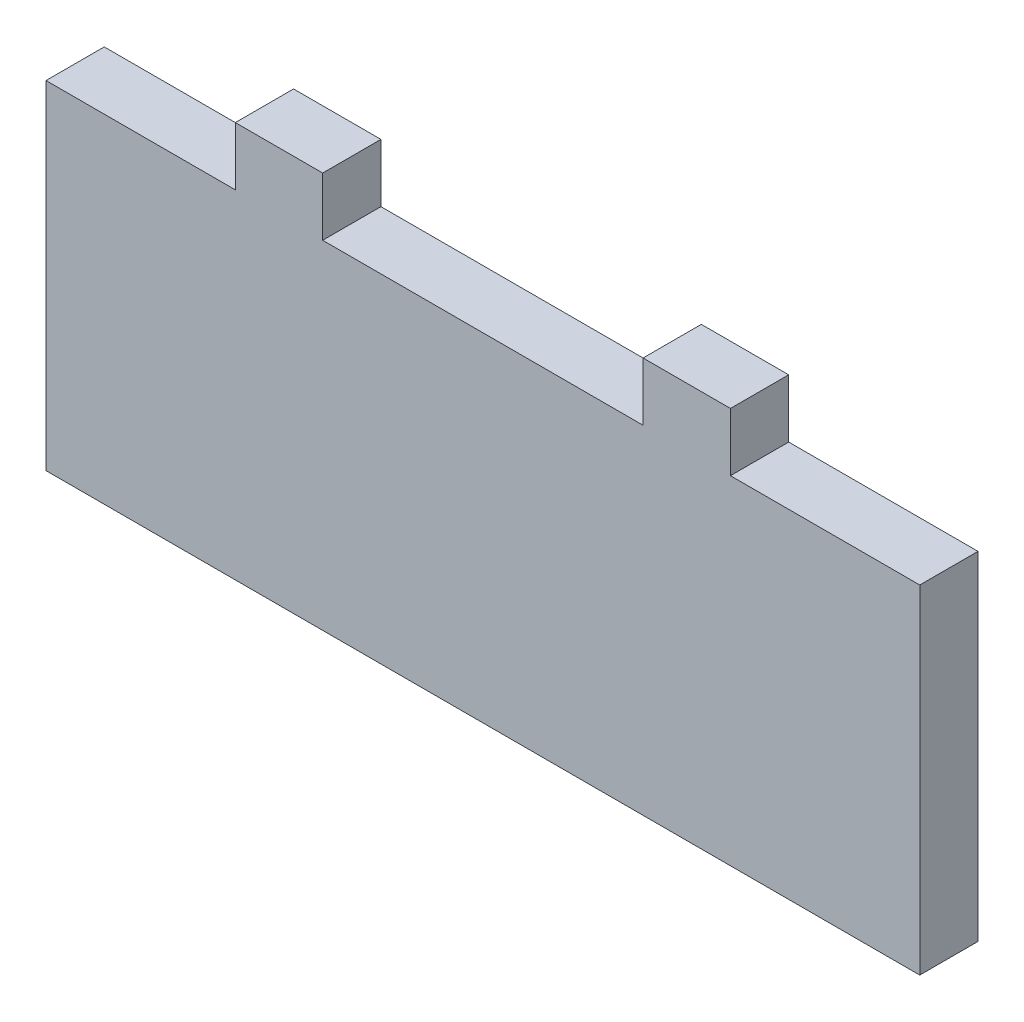
ISO-10303-21;
HEADER;
FILE_DESCRIPTION(('STEP AP214'),'2;1');
FILE_NAME('part.step','',(''),(''),'','','');
FILE_SCHEMA(('AUTOMOTIVE_DESIGN { 1 0 10303 214 1 1 1 1 }'));
ENDSEC;
DATA;
#1=APPLICATION_CONTEXT('core data for automotive mechanical design processes');
#2=APPLICATION_PROTOCOL_DEFINITION('international standard','automotive_design',2000,#1);
#3=PRODUCT_CONTEXT('',#1,'mechanical');
#4=PRODUCT('Part','Part','',(#3));
#5=PRODUCT_RELATED_PRODUCT_CATEGORY('part','',(#4));
#6=PRODUCT_DEFINITION_FORMATION('','',#4);
#7=PRODUCT_DEFINITION_CONTEXT('part definition',#1,'design');
#8=PRODUCT_DEFINITION('design','',#6,#7);
#9=PRODUCT_DEFINITION_SHAPE('','',#8);
#10=(LENGTH_UNIT() NAMED_UNIT(*) SI_UNIT(.MILLI.,.METRE.));
#11=(NAMED_UNIT(*) PLANE_ANGLE_UNIT() SI_UNIT($,.RADIAN.));
#12=(NAMED_UNIT(*) SI_UNIT($,.STERADIAN.) SOLID_ANGLE_UNIT());
#13=UNCERTAINTY_MEASURE_WITH_UNIT(LENGTH_MEASURE(1.E-05),#10,'distance_accuracy_value','');
#14=(GEOMETRIC_REPRESENTATION_CONTEXT(3) GLOBAL_UNCERTAINTY_ASSIGNED_CONTEXT((#13)) GLOBAL_UNIT_ASSIGNED_CONTEXT((#10,
#11,#12)) REPRESENTATION_CONTEXT('',''));
#15=CARTESIAN_POINT('',(0.,0.,0.));
#16=DIRECTION('',(0.,0.,1.));
#17=DIRECTION('',(1.,0.,0.));
#18=AXIS2_PLACEMENT_3D('',#15,#16,#17);
#19=CARTESIAN_POINT('',(-95.2500000000001,215.9,-12.7));
#20=DIRECTION('',(-1.,0.,0.));
#21=DIRECTION('',(0.,-1.,0.));
#22=AXIS2_PLACEMENT_3D('',#19,#20,#21);
#23=PLANE('',#22);
#24=DIRECTION('',(0.,-1.,0.));
#25=VECTOR('',#24,1.);
#26=CARTESIAN_POINT('',(-95.2500000000001,215.9,0.));
#27=LINE('',#26,#25);
#28=CARTESIAN_POINT('',(-95.2500000000001,215.9,0.));
#29=VERTEX_POINT('',#28);
#30=CARTESIAN_POINT('',(-95.2500000000001,142.24,0.));
#31=VERTEX_POINT('',#30);
#32=EDGE_CURVE('E154',#29,#31,#27,.T.);
#33=ORIENTED_EDGE('',*,*,#32,.F.);
#34=DIRECTION('',(0.,0.,1.));
#35=VECTOR('',#34,1.);
#36=CARTESIAN_POINT('',(-95.2500000000001,215.9,-12.7));
#37=LINE('',#36,#35);
#38=CARTESIAN_POINT('',(-95.2500000000001,215.9,-12.7));
#39=VERTEX_POINT('',#38);
#40=EDGE_CURVE('E11',#39,#29,#37,.T.);
#41=ORIENTED_EDGE('',*,*,#40,.F.);
#42=DIRECTION('',(0.,-1.,0.));
#43=VECTOR('',#42,1.);
#44=CARTESIAN_POINT('',(-95.2500000000001,215.9,-12.7));
#45=LINE('',#44,#43);
#46=CARTESIAN_POINT('',(-95.2500000000001,142.24,-12.7));
#47=VERTEX_POINT('',#46);
#48=EDGE_CURVE('E186',#39,#47,#45,.T.);
#49=ORIENTED_EDGE('',*,*,#48,.T.);
#50=DIRECTION('',(0.,0.,1.));
#51=VECTOR('',#50,1.);
#52=CARTESIAN_POINT('',(-95.2500000000001,142.24,-12.7));
#53=LINE('',#52,#51);
#54=EDGE_CURVE('E36',#47,#31,#53,.T.);
#55=ORIENTED_EDGE('',*,*,#54,.T.);
#56=EDGE_LOOP('',(#33,#41,#49,#55));
#57=FACE_BOUND('',#56,.T.);
#58=ADVANCED_FACE('F33',(#57),#23,.T.);
#59=CARTESIAN_POINT('',(-95.2500000000001,215.9,-12.7));
#60=DIRECTION('',(0.,1.,0.));
#61=DIRECTION('',(0.,0.,1.));
#62=AXIS2_PLACEMENT_3D('',#59,#60,#61);
#63=PLANE('',#62);
#64=DIRECTION('',(-1.,0.,0.));
#65=VECTOR('',#64,1.);
#66=CARTESIAN_POINT('',(-95.2500000000001,215.9,0.));
#67=LINE('',#66,#65);
#68=CARTESIAN_POINT('',(-53.9750000000001,215.9,0.));
#69=VERTEX_POINT('',#68);
#70=EDGE_CURVE('E184',#69,#29,#67,.T.);
#71=ORIENTED_EDGE('',*,*,#70,.F.);
#72=DIRECTION('',(0.,0.,1.));
#73=VECTOR('',#72,1.);
#74=CARTESIAN_POINT('',(-53.9750000000001,215.9,-12.7));
#75=LINE('',#74,#73);
#76=CARTESIAN_POINT('',(-53.9750000000001,215.9,-12.7));
#77=VERTEX_POINT('',#76);
#78=EDGE_CURVE('E42',#77,#69,#75,.T.);
#79=ORIENTED_EDGE('',*,*,#78,.F.);
#80=DIRECTION('',(-1.,0.,0.));
#81=VECTOR('',#80,1.);
#82=CARTESIAN_POINT('',(-95.2500000000001,215.9,-12.7));
#83=LINE('',#82,#81);
#84=EDGE_CURVE('E144',#77,#39,#83,.T.);
#85=ORIENTED_EDGE('',*,*,#84,.T.);
#86=ORIENTED_EDGE('',*,*,#40,.T.);
#87=EDGE_LOOP('',(#71,#79,#85,#86));
#88=FACE_BOUND('',#87,.T.);
#89=ADVANCED_FACE('F206',(#88),#63,.T.);
#90=CARTESIAN_POINT('',(-53.9750000000001,215.9,-12.7));
#91=DIRECTION('',(-1.,0.,0.));
#92=DIRECTION('',(0.,-1.,0.));
#93=AXIS2_PLACEMENT_3D('',#90,#91,#92);
#94=PLANE('',#93);
#95=DIRECTION('',(0.,-1.,0.));
#96=VECTOR('',#95,1.);
#97=CARTESIAN_POINT('',(-53.9750000000001,215.9,0.));
#98=LINE('',#97,#96);
#99=CARTESIAN_POINT('',(-53.9750000000001,228.6,0.));
#100=VERTEX_POINT('',#99);
#101=EDGE_CURVE('E131',#100,#69,#98,.T.);
#102=ORIENTED_EDGE('',*,*,#101,.F.);
#103=DIRECTION('',(0.,0.,1.));
#104=VECTOR('',#103,1.);
#105=CARTESIAN_POINT('',(-53.9750000000001,228.6,-12.7));
#106=LINE('',#105,#104);
#107=CARTESIAN_POINT('',(-53.9750000000001,228.6,-12.7));
#108=VERTEX_POINT('',#107);
#109=EDGE_CURVE('E126',#108,#100,#106,.T.);
#110=ORIENTED_EDGE('',*,*,#109,.F.);
#111=DIRECTION('',(0.,-1.,0.));
#112=VECTOR('',#111,1.);
#113=CARTESIAN_POINT('',(-53.9750000000001,215.9,-12.7));
#114=LINE('',#113,#112);
#115=EDGE_CURVE('E129',#108,#77,#114,.T.);
#116=ORIENTED_EDGE('',*,*,#115,.T.);
#117=ORIENTED_EDGE('',*,*,#78,.T.);
#118=EDGE_LOOP('',(#102,#110,#116,#117));
#119=FACE_BOUND('',#118,.T.);
#120=ADVANCED_FACE('F128',(#119),#94,.T.);
#121=CARTESIAN_POINT('',(-34.9250000000001,228.6,-12.7));
#122=DIRECTION('',(0.,1.,0.));
#123=DIRECTION('',(0.,0.,1.));
#124=AXIS2_PLACEMENT_3D('',#121,#122,#123);
#125=PLANE('',#124);
#126=DIRECTION('',(-1.,0.,0.));
#127=VECTOR('',#126,1.);
#128=CARTESIAN_POINT('',(-34.9250000000001,228.6,0.));
#129=LINE('',#128,#127);
#130=CARTESIAN_POINT('',(-34.9250000000001,228.6,0.));
#131=VERTEX_POINT('',#130);
#132=EDGE_CURVE('E181',#131,#100,#129,.T.);
#133=ORIENTED_EDGE('',*,*,#132,.F.);
#134=DIRECTION('',(0.,0.,1.));
#135=VECTOR('',#134,1.);
#136=CARTESIAN_POINT('',(-34.9250000000001,228.6,-12.7));
#137=LINE('',#136,#135);
#138=CARTESIAN_POINT('',(-34.9250000000001,228.6,-12.7));
#139=VERTEX_POINT('',#138);
#140=EDGE_CURVE('E136',#139,#131,#137,.T.);
#141=ORIENTED_EDGE('',*,*,#140,.F.);
#142=DIRECTION('',(-1.,0.,0.));
#143=VECTOR('',#142,1.);
#144=CARTESIAN_POINT('',(-34.9250000000001,228.6,-12.7));
#145=LINE('',#144,#143);
#146=EDGE_CURVE('E142',#139,#108,#145,.T.);
#147=ORIENTED_EDGE('',*,*,#146,.T.);
#148=ORIENTED_EDGE('',*,*,#109,.T.);
#149=EDGE_LOOP('',(#133,#141,#147,#148));
#150=FACE_BOUND('',#149,.T.);
#151=ADVANCED_FACE('F146',(#150),#125,.T.);
#152=CARTESIAN_POINT('',(-34.9250000000001,215.9,-12.7));
#153=DIRECTION('',(1.,0.,0.));
#154=DIRECTION('',(0.,0.,-1.));
#155=AXIS2_PLACEMENT_3D('',#152,#153,#154);
#156=PLANE('',#155);
#157=DIRECTION('',(0.,1.,0.));
#158=VECTOR('',#157,1.);
#159=CARTESIAN_POINT('',(-34.9250000000001,215.9,0.));
#160=LINE('',#159,#158);
#161=CARTESIAN_POINT('',(-34.9250000000001,215.9,0.));
#162=VERTEX_POINT('',#161);
#163=EDGE_CURVE('E178',#162,#131,#160,.T.);
#164=ORIENTED_EDGE('',*,*,#163,.F.);
#165=DIRECTION('',(0.,0.,1.));
#166=VECTOR('',#165,1.);
#167=CARTESIAN_POINT('',(-34.9250000000001,215.9,-12.7));
#168=LINE('',#167,#166);
#169=CARTESIAN_POINT('',(-34.9250000000001,215.9,-12.7));
#170=VERTEX_POINT('',#169);
#171=EDGE_CURVE('E190',#170,#162,#168,.T.);
#172=ORIENTED_EDGE('',*,*,#171,.F.);
#173=DIRECTION('',(0.,1.,0.));
#174=VECTOR('',#173,1.);
#175=CARTESIAN_POINT('',(-34.9250000000001,215.9,-12.7));
#176=LINE('',#175,#174);
#177=EDGE_CURVE('E147',#170,#139,#176,.T.);
#178=ORIENTED_EDGE('',*,*,#177,.T.);
#179=ORIENTED_EDGE('',*,*,#140,.T.);
#180=EDGE_LOOP('',(#164,#172,#178,#179));
#181=FACE_BOUND('',#180,.T.);
#182=ADVANCED_FACE('F219',(#181),#156,.T.);
#183=CARTESIAN_POINT('',(-34.9250000000001,215.9,-12.7));
#184=DIRECTION('',(0.,1.,0.));
#185=DIRECTION('',(0.,0.,1.));
#186=AXIS2_PLACEMENT_3D('',#183,#184,#185);
#187=PLANE('',#186);
#188=DIRECTION('',(-1.,0.,0.));
#189=VECTOR('',#188,1.);
#190=CARTESIAN_POINT('',(-34.9250000000001,215.9,0.));
#191=LINE('',#190,#189);
#192=CARTESIAN_POINT('',(34.9249999999999,215.9,0.));
#193=VERTEX_POINT('',#192);
#194=EDGE_CURVE('E175',#193,#162,#191,.T.);
#195=ORIENTED_EDGE('',*,*,#194,.F.);
#196=DIRECTION('',(0.,0.,1.));
#197=VECTOR('',#196,1.);
#198=CARTESIAN_POINT('',(34.9249999999999,215.9,-12.7));
#199=LINE('',#198,#197);
#200=CARTESIAN_POINT('',(34.9249999999999,215.9,-12.7));
#201=VERTEX_POINT('',#200);
#202=EDGE_CURVE('E192',#201,#193,#199,.T.);
#203=ORIENTED_EDGE('',*,*,#202,.F.);
#204=DIRECTION('',(-1.,0.,0.));
#205=VECTOR('',#204,1.);
#206=CARTESIAN_POINT('',(-34.9250000000001,215.9,-12.7));
#207=LINE('',#206,#205);
#208=EDGE_CURVE('E149',#201,#170,#207,.T.);
#209=ORIENTED_EDGE('',*,*,#208,.T.);
#210=ORIENTED_EDGE('',*,*,#171,.T.);
#211=EDGE_LOOP('',(#195,#203,#209,#210));
#212=FACE_BOUND('',#211,.T.);
#213=ADVANCED_FACE('F222',(#212),#187,.T.);
#214=CARTESIAN_POINT('',(34.9249999999999,215.9,-12.7));
#215=DIRECTION('',(-1.,0.,0.));
#216=DIRECTION('',(0.,0.,1.));
#217=AXIS2_PLACEMENT_3D('',#214,#215,#216);
#218=PLANE('',#217);
#219=DIRECTION('',(0.,-1.,0.));
#220=VECTOR('',#219,1.);
#221=CARTESIAN_POINT('',(34.9249999999999,215.9,0.));
#222=LINE('',#221,#220);
#223=CARTESIAN_POINT('',(34.9249999999999,228.6,0.));
#224=VERTEX_POINT('',#223);
#225=EDGE_CURVE('E172',#224,#193,#222,.T.);
#226=ORIENTED_EDGE('',*,*,#225,.F.);
#227=DIRECTION('',(0.,0.,1.));
#228=VECTOR('',#227,1.);
#229=CARTESIAN_POINT('',(34.9249999999999,228.6,-12.7));
#230=LINE('',#229,#228);
#231=CARTESIAN_POINT('',(34.9249999999999,228.6,-12.7));
#232=VERTEX_POINT('',#231);
#233=EDGE_CURVE('E194',#232,#224,#230,.T.);
#234=ORIENTED_EDGE('',*,*,#233,.F.);
#235=DIRECTION('',(0.,-1.,0.));
#236=VECTOR('',#235,1.);
#237=CARTESIAN_POINT('',(34.9249999999999,215.9,-12.7));
#238=LINE('',#237,#236);
#239=EDGE_CURVE('E348',#232,#201,#238,.T.);
#240=ORIENTED_EDGE('',*,*,#239,.T.);
#241=ORIENTED_EDGE('',*,*,#202,.T.);
#242=EDGE_LOOP('',(#226,#234,#240,#241));
#243=FACE_BOUND('',#242,.T.);
#244=ADVANCED_FACE('F226',(#243),#218,.T.);
#245=CARTESIAN_POINT('',(53.9749999999999,228.6,-12.7));
#246=DIRECTION('',(0.,1.,0.));
#247=DIRECTION('',(0.,0.,1.));
#248=AXIS2_PLACEMENT_3D('',#245,#246,#247);
#249=PLANE('',#248);
#250=DIRECTION('',(-1.,0.,0.));
#251=VECTOR('',#250,1.);
#252=CARTESIAN_POINT('',(53.9749999999999,228.6,0.));
#253=LINE('',#252,#251);
#254=CARTESIAN_POINT('',(53.9749999999999,228.6,0.));
#255=VERTEX_POINT('',#254);
#256=EDGE_CURVE('E169',#255,#224,#253,.T.);
#257=ORIENTED_EDGE('',*,*,#256,.F.);
#258=DIRECTION('',(0.,0.,1.));
#259=VECTOR('',#258,1.);
#260=CARTESIAN_POINT('',(53.9749999999999,228.6,-12.7));
#261=LINE('',#260,#259);
#262=CARTESIAN_POINT('',(53.9749999999999,228.6,-12.7));
#263=VERTEX_POINT('',#262);
#264=EDGE_CURVE('E196',#263,#255,#261,.T.);
#265=ORIENTED_EDGE('',*,*,#264,.F.);
#266=DIRECTION('',(-1.,0.,0.));
#267=VECTOR('',#266,1.);
#268=CARTESIAN_POINT('',(53.9749999999999,228.6,-12.7));
#269=LINE('',#268,#267);
#270=EDGE_CURVE('E352',#263,#232,#269,.T.);
#271=ORIENTED_EDGE('',*,*,#270,.T.);
#272=ORIENTED_EDGE('',*,*,#233,.T.);
#273=EDGE_LOOP('',(#257,#265,#271,#272));
#274=FACE_BOUND('',#273,.T.);
#275=ADVANCED_FACE('F230',(#274),#249,.T.);
#276=CARTESIAN_POINT('',(53.9749999999999,215.9,-12.7));
#277=DIRECTION('',(1.,0.,0.));
#278=DIRECTION('',(0.,0.,-1.));
#279=AXIS2_PLACEMENT_3D('',#276,#277,#278);
#280=PLANE('',#279);
#281=DIRECTION('',(0.,1.,0.));
#282=VECTOR('',#281,1.);
#283=CARTESIAN_POINT('',(53.9749999999999,215.9,0.));
#284=LINE('',#283,#282);
#285=CARTESIAN_POINT('',(53.9749999999999,215.9,0.));
#286=VERTEX_POINT('',#285);
#287=EDGE_CURVE('E166',#286,#255,#284,.T.);
#288=ORIENTED_EDGE('',*,*,#287,.F.);
#289=DIRECTION('',(0.,0.,1.));
#290=VECTOR('',#289,1.);
#291=CARTESIAN_POINT('',(53.9749999999999,215.9,-12.7));
#292=LINE('',#291,#290);
#293=CARTESIAN_POINT('',(53.9749999999999,215.9,-12.7));
#294=VERTEX_POINT('',#293);
#295=EDGE_CURVE('E198',#294,#286,#292,.T.);
#296=ORIENTED_EDGE('',*,*,#295,.F.);
#297=DIRECTION('',(0.,1.,0.));
#298=VECTOR('',#297,1.);
#299=CARTESIAN_POINT('',(53.9749999999999,215.9,-12.7));
#300=LINE('',#299,#298);
#301=EDGE_CURVE('E341',#294,#263,#300,.T.);
#302=ORIENTED_EDGE('',*,*,#301,.T.);
#303=ORIENTED_EDGE('',*,*,#264,.T.);
#304=EDGE_LOOP('',(#288,#296,#302,#303));
#305=FACE_BOUND('',#304,.T.);
#306=ADVANCED_FACE('F234',(#305),#280,.T.);
#307=CARTESIAN_POINT('',(53.9749999999999,215.9,-12.7));
#308=DIRECTION('',(0.,1.,0.));
#309=DIRECTION('',(0.,0.,1.));
#310=AXIS2_PLACEMENT_3D('',#307,#308,#309);
#311=PLANE('',#310);
#312=DIRECTION('',(-1.,0.,0.));
#313=VECTOR('',#312,1.);
#314=CARTESIAN_POINT('',(53.9749999999999,215.9,0.));
#315=LINE('',#314,#313);
#316=CARTESIAN_POINT('',(95.2499999999999,215.9,0.));
#317=VERTEX_POINT('',#316);
#318=EDGE_CURVE('E163',#317,#286,#315,.T.);
#319=ORIENTED_EDGE('',*,*,#318,.F.);
#320=DIRECTION('',(0.,0.,1.));
#321=VECTOR('',#320,1.);
#322=CARTESIAN_POINT('',(95.2499999999999,215.9,-12.7));
#323=LINE('',#322,#321);
#324=CARTESIAN_POINT('',(95.2499999999999,215.9,-12.7));
#325=VERTEX_POINT('',#324);
#326=EDGE_CURVE('E200',#325,#317,#323,.T.);
#327=ORIENTED_EDGE('',*,*,#326,.F.);
#328=DIRECTION('',(-1.,0.,0.));
#329=VECTOR('',#328,1.);
#330=CARTESIAN_POINT('',(53.9749999999999,215.9,-12.7));
#331=LINE('',#330,#329);
#332=EDGE_CURVE('E337',#325,#294,#331,.T.);
#333=ORIENTED_EDGE('',*,*,#332,.T.);
#334=ORIENTED_EDGE('',*,*,#295,.T.);
#335=EDGE_LOOP('',(#319,#327,#333,#334));
#336=FACE_BOUND('',#335,.T.);
#337=ADVANCED_FACE('F238',(#336),#311,.T.);
#338=CARTESIAN_POINT('',(95.2499999999999,215.9,-12.7));
#339=DIRECTION('',(1.,0.,0.));
#340=DIRECTION('',(0.,1.,0.));
#341=AXIS2_PLACEMENT_3D('',#338,#339,#340);
#342=PLANE('',#341);
#343=DIRECTION('',(0.,1.,0.));
#344=VECTOR('',#343,1.);
#345=CARTESIAN_POINT('',(95.2499999999999,215.9,0.));
#346=LINE('',#345,#344);
#347=CARTESIAN_POINT('',(95.25,142.24,0.));
#348=VERTEX_POINT('',#347);
#349=EDGE_CURVE('E160',#348,#317,#346,.T.);
#350=ORIENTED_EDGE('',*,*,#349,.F.);
#351=DIRECTION('',(0.,0.,1.));
#352=VECTOR('',#351,1.);
#353=CARTESIAN_POINT('',(95.25,142.24,-12.7));
#354=LINE('',#353,#352);
#355=CARTESIAN_POINT('',(95.25,142.24,-12.7));
#356=VERTEX_POINT('',#355);
#357=EDGE_CURVE('E201',#356,#348,#354,.T.);
#358=ORIENTED_EDGE('',*,*,#357,.F.);
#359=DIRECTION('',(0.,1.,0.));
#360=VECTOR('',#359,1.);
#361=CARTESIAN_POINT('',(95.2499999999999,215.9,-12.7));
#362=LINE('',#361,#360);
#363=EDGE_CURVE('E358',#356,#325,#362,.T.);
#364=ORIENTED_EDGE('',*,*,#363,.T.);
#365=ORIENTED_EDGE('',*,*,#326,.T.);
#366=EDGE_LOOP('',(#350,#358,#364,#365));
#367=FACE_BOUND('',#366,.T.);
#368=ADVANCED_FACE('F242',(#367),#342,.T.);
#369=CARTESIAN_POINT('',(-95.2500000000001,142.24,-12.7));
#370=DIRECTION('',(0.,-1.,0.));
#371=DIRECTION('',(0.,0.,-1.));
#372=AXIS2_PLACEMENT_3D('',#369,#370,#371);
#373=PLANE('',#372);
#374=DIRECTION('',(1.,0.,0.));
#375=VECTOR('',#374,1.);
#376=CARTESIAN_POINT('',(-95.2500000000001,142.24,0.));
#377=LINE('',#376,#375);
#378=EDGE_CURVE('E157',#31,#348,#377,.T.);
#379=ORIENTED_EDGE('',*,*,#378,.F.);
#380=ORIENTED_EDGE('',*,*,#54,.F.);
#381=DIRECTION('',(1.,0.,0.));
#382=VECTOR('',#381,1.);
#383=CARTESIAN_POINT('',(-95.2500000000001,142.24,-12.7));
#384=LINE('',#383,#382);
#385=EDGE_CURVE('E360',#47,#356,#384,.T.);
#386=ORIENTED_EDGE('',*,*,#385,.T.);
#387=ORIENTED_EDGE('',*,*,#357,.T.);
#388=EDGE_LOOP('',(#379,#380,#386,#387));
#389=FACE_BOUND('',#388,.T.);
#390=ADVANCED_FACE('F203',(#389),#373,.T.);
#391=CARTESIAN_POINT('',(-95.2500000000001,142.24,-12.7));
#392=DIRECTION('',(0.,0.,1.));
#393=DIRECTION('',(1.,0.,0.));
#394=AXIS2_PLACEMENT_3D('',#391,#392,#393);
#395=PLANE('',#394);
#396=ORIENTED_EDGE('',*,*,#48,.F.);
#397=ORIENTED_EDGE('',*,*,#84,.F.);
#398=ORIENTED_EDGE('',*,*,#115,.F.);
#399=ORIENTED_EDGE('',*,*,#146,.F.);
#400=ORIENTED_EDGE('',*,*,#177,.F.);
#401=ORIENTED_EDGE('',*,*,#208,.F.);
#402=ORIENTED_EDGE('',*,*,#239,.F.);
#403=ORIENTED_EDGE('',*,*,#270,.F.);
#404=ORIENTED_EDGE('',*,*,#301,.F.);
#405=ORIENTED_EDGE('',*,*,#332,.F.);
#406=ORIENTED_EDGE('',*,*,#363,.F.);
#407=ORIENTED_EDGE('',*,*,#385,.F.);
#408=EDGE_LOOP('',(#396,#397,#398,#399,#400,#401,#402,#403,#404,#405,#406,#407));
#409=FACE_BOUND('',#408,.T.);
#410=ADVANCED_FACE('F140',(#409),#395,.F.);
#411=CARTESIAN_POINT('',(-95.2500000000001,142.24,0.));
#412=DIRECTION('',(0.,0.,1.));
#413=DIRECTION('',(1.,0.,0.));
#414=AXIS2_PLACEMENT_3D('',#411,#412,#413);
#415=PLANE('',#414);
#416=ORIENTED_EDGE('',*,*,#32,.T.);
#417=ORIENTED_EDGE('',*,*,#378,.T.);
#418=ORIENTED_EDGE('',*,*,#349,.T.);
#419=ORIENTED_EDGE('',*,*,#318,.T.);
#420=ORIENTED_EDGE('',*,*,#287,.T.);
#421=ORIENTED_EDGE('',*,*,#256,.T.);
#422=ORIENTED_EDGE('',*,*,#225,.T.);
#423=ORIENTED_EDGE('',*,*,#194,.T.);
#424=ORIENTED_EDGE('',*,*,#163,.T.);
#425=ORIENTED_EDGE('',*,*,#132,.T.);
#426=ORIENTED_EDGE('',*,*,#101,.T.);
#427=ORIENTED_EDGE('',*,*,#70,.T.);
#428=EDGE_LOOP('',(#416,#417,#418,#419,#420,#421,#422,#423,#424,#425,#426,#427));
#429=FACE_BOUND('',#428,.T.);
#430=ADVANCED_FACE('F205',(#429),#415,.T.);
#431=CLOSED_SHELL('',(#58,#89,#120,#151,#182,#213,#244,#275,#306,#337,#368,#390,#410,#430));
#432=MANIFOLD_SOLID_BREP('B2',#431);
#433=ADVANCED_BREP_SHAPE_REPRESENTATION('',(#18,#432),#14);
#434=SHAPE_DEFINITION_REPRESENTATION(#9,#433);
ENDSEC;
END-ISO-10303-21;
